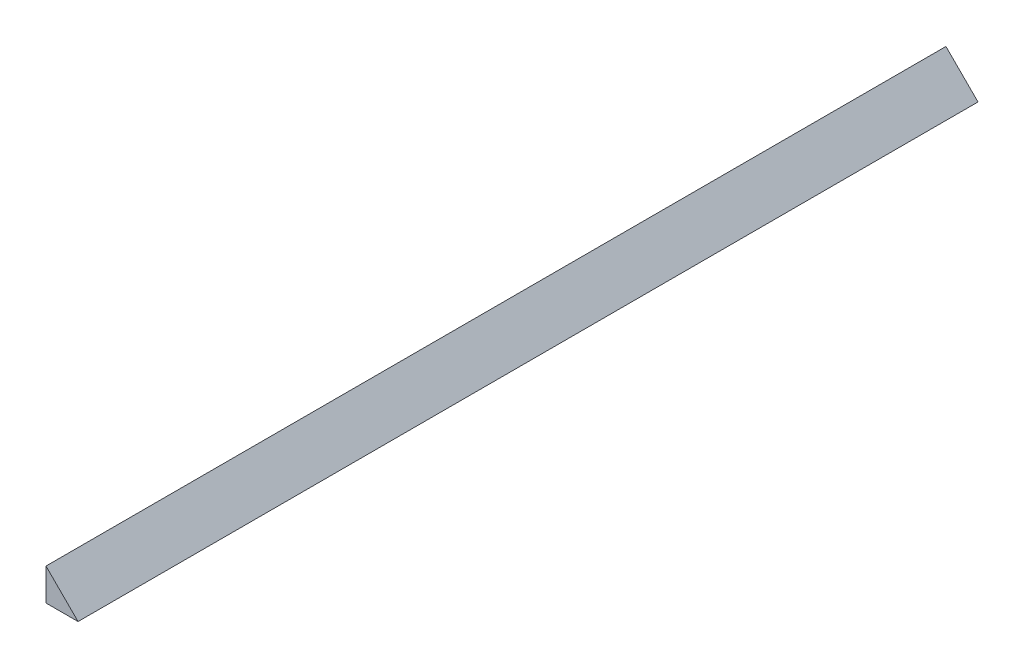
ISO-10303-21;
HEADER;
FILE_DESCRIPTION(('STEP AP214'),'2;1');
FILE_NAME('part.step','',(''),(''),'','','');
FILE_SCHEMA(('AUTOMOTIVE_DESIGN { 1 0 10303 214 1 1 1 1 }'));
ENDSEC;
DATA;
#1=APPLICATION_CONTEXT('core data for automotive mechanical design processes');
#2=APPLICATION_PROTOCOL_DEFINITION('international standard','automotive_design',2000,#1);
#3=PRODUCT_CONTEXT('',#1,'mechanical');
#4=PRODUCT('Part','Part','',(#3));
#5=PRODUCT_RELATED_PRODUCT_CATEGORY('part','',(#4));
#6=PRODUCT_DEFINITION_FORMATION('','',#4);
#7=PRODUCT_DEFINITION_CONTEXT('part definition',#1,'design');
#8=PRODUCT_DEFINITION('design','',#6,#7);
#9=PRODUCT_DEFINITION_SHAPE('','',#8);
#10=(LENGTH_UNIT() NAMED_UNIT(*) SI_UNIT(.MILLI.,.METRE.));
#11=(NAMED_UNIT(*) PLANE_ANGLE_UNIT() SI_UNIT($,.RADIAN.));
#12=(NAMED_UNIT(*) SI_UNIT($,.STERADIAN.) SOLID_ANGLE_UNIT());
#13=UNCERTAINTY_MEASURE_WITH_UNIT(LENGTH_MEASURE(1.E-05),#10,'distance_accuracy_value','');
#14=(GEOMETRIC_REPRESENTATION_CONTEXT(3) GLOBAL_UNCERTAINTY_ASSIGNED_CONTEXT((#13)) GLOBAL_UNIT_ASSIGNED_CONTEXT((#10,
#11,#12)) REPRESENTATION_CONTEXT('',''));
#15=CARTESIAN_POINT('',(0.,0.,0.));
#16=DIRECTION('',(0.,0.,1.));
#17=DIRECTION('',(1.,0.,0.));
#18=AXIS2_PLACEMENT_3D('',#15,#16,#17);
#19=CARTESIAN_POINT('',(0.,2.6,-76.6769552621701));
#20=DIRECTION('',(-1.,0.,0.));
#21=DIRECTION('',(0.,0.,1.));
#22=AXIS2_PLACEMENT_3D('',#19,#20,#21);
#23=PLANE('',#22);
#24=DIRECTION('',(0.,1.,0.));
#25=VECTOR('',#24,1.);
#26=CARTESIAN_POINT('',(0.,2.6,-73.));
#27=LINE('',#26,#25);
#28=CARTESIAN_POINT('',(0.,0.,-73.));
#29=VERTEX_POINT('',#28);
#30=CARTESIAN_POINT('',(0.,2.60000000000004,-73.));
#31=VERTEX_POINT('',#30);
#32=EDGE_CURVE('E11',#29,#31,#27,.T.);
#33=ORIENTED_EDGE('',*,*,#32,.F.);
#34=DIRECTION('',(0.,0.,1.));
#35=VECTOR('',#34,1.);
#36=CARTESIAN_POINT('',(0.,0.,-76.6769552621701));
#37=LINE('',#36,#35);
#38=CARTESIAN_POINT('',(0.,0.,0.));
#39=VERTEX_POINT('',#38);
#40=EDGE_CURVE('E105',#29,#39,#37,.T.);
#41=ORIENTED_EDGE('',*,*,#40,.T.);
#42=DIRECTION('',(0.,-1.,0.));
#43=VECTOR('',#42,1.);
#44=CARTESIAN_POINT('',(0.,2.6,0.));
#45=LINE('',#44,#43);
#46=CARTESIAN_POINT('',(0.,2.6,0.));
#47=VERTEX_POINT('',#46);
#48=EDGE_CURVE('E85',#47,#39,#45,.T.);
#49=ORIENTED_EDGE('',*,*,#48,.F.);
#50=DIRECTION('',(0.,0.,1.));
#51=VECTOR('',#50,1.);
#52=CARTESIAN_POINT('',(0.,2.6,-76.6769552621701));
#53=LINE('',#52,#51);
#54=EDGE_CURVE('E86',#31,#47,#53,.T.);
#55=ORIENTED_EDGE('',*,*,#54,.F.);
#56=EDGE_LOOP('',(#33,#41,#49,#55));
#57=FACE_BOUND('',#56,.T.);
#58=ADVANCED_FACE('F39',(#57),#23,.T.);
#59=CARTESIAN_POINT('',(2.59999999999997,0.,-76.6769552621701));
#60=DIRECTION('',(0.707106781186551,0.707106781186544,0.));
#61=DIRECTION('',(-0.707106781186544,0.707106781186551,0.));
#62=AXIS2_PLACEMENT_3D('',#59,#60,#61);
#63=PLANE('',#62);
#64=DIRECTION('',(0.707106781186544,-0.707106781186551,0.));
#65=VECTOR('',#64,1.);
#66=CARTESIAN_POINT('',(2.59999999999997,0.,-73.));
#67=LINE('',#66,#65);
#68=CARTESIAN_POINT('',(2.59999999999997,0.,-73.));
#69=VERTEX_POINT('',#68);
#70=EDGE_CURVE('E43',#31,#69,#67,.T.);
#71=ORIENTED_EDGE('',*,*,#70,.F.);
#72=ORIENTED_EDGE('',*,*,#54,.T.);
#73=DIRECTION('',(-0.707106781186544,0.707106781186551,0.));
#74=VECTOR('',#73,1.);
#75=CARTESIAN_POINT('',(2.59999999999997,0.,0.));
#76=LINE('',#75,#74);
#77=CARTESIAN_POINT('',(2.59999999999997,0.,0.));
#78=VERTEX_POINT('',#77);
#79=EDGE_CURVE('E91',#78,#47,#76,.T.);
#80=ORIENTED_EDGE('',*,*,#79,.F.);
#81=DIRECTION('',(0.,0.,1.));
#82=VECTOR('',#81,1.);
#83=CARTESIAN_POINT('',(2.59999999999997,0.,-76.6769552621701));
#84=LINE('',#83,#82);
#85=EDGE_CURVE('E76',#69,#78,#84,.T.);
#86=ORIENTED_EDGE('',*,*,#85,.F.);
#87=EDGE_LOOP('',(#71,#72,#80,#86));
#88=FACE_BOUND('',#87,.T.);
#89=ADVANCED_FACE('F95',(#88),#63,.T.);
#90=CARTESIAN_POINT('',(0.,0.,-76.6769552621701));
#91=DIRECTION('',(0.,-1.,0.));
#92=DIRECTION('',(0.,0.,-1.));
#93=AXIS2_PLACEMENT_3D('',#90,#91,#92);
#94=PLANE('',#93);
#95=DIRECTION('',(-1.,0.,0.));
#96=VECTOR('',#95,1.);
#97=CARTESIAN_POINT('',(0.,0.,-73.));
#98=LINE('',#97,#96);
#99=EDGE_CURVE('E50',#69,#29,#98,.T.);
#100=ORIENTED_EDGE('',*,*,#99,.F.);
#101=ORIENTED_EDGE('',*,*,#85,.T.);
#102=DIRECTION('',(1.,0.,0.));
#103=VECTOR('',#102,1.);
#104=CARTESIAN_POINT('',(0.,0.,0.));
#105=LINE('',#104,#103);
#106=EDGE_CURVE('E80',#39,#78,#105,.T.);
#107=ORIENTED_EDGE('',*,*,#106,.F.);
#108=ORIENTED_EDGE('',*,*,#40,.F.);
#109=EDGE_LOOP('',(#100,#101,#107,#108));
#110=FACE_BOUND('',#109,.T.);
#111=ADVANCED_FACE('F78',(#110),#94,.T.);
#112=CARTESIAN_POINT('',(0.,0.,0.));
#113=DIRECTION('',(0.,0.,1.));
#114=DIRECTION('',(1.,0.,0.));
#115=AXIS2_PLACEMENT_3D('',#112,#113,#114);
#116=PLANE('',#115);
#117=ORIENTED_EDGE('',*,*,#48,.T.);
#118=ORIENTED_EDGE('',*,*,#106,.T.);
#119=ORIENTED_EDGE('',*,*,#79,.T.);
#120=EDGE_LOOP('',(#117,#118,#119));
#121=FACE_BOUND('',#120,.T.);
#122=ADVANCED_FACE('F90',(#121),#116,.T.);
#123=CARTESIAN_POINT('',(7.49999999999997,202.4,-73.));
#124=DIRECTION('',(0.,0.,1.));
#125=DIRECTION('',(-1.,0.,0.));
#126=AXIS2_PLACEMENT_3D('',#123,#124,#125);
#127=PLANE('',#126);
#128=ORIENTED_EDGE('',*,*,#70,.T.);
#129=ORIENTED_EDGE('',*,*,#99,.T.);
#130=ORIENTED_EDGE('',*,*,#32,.T.);
#131=EDGE_LOOP('',(#128,#129,#130));
#132=FACE_BOUND('',#131,.T.);
#133=ADVANCED_FACE('F41',(#132),#127,.F.);
#134=CLOSED_SHELL('',(#58,#89,#111,#122,#133));
#135=MANIFOLD_SOLID_BREP('B2',#134);
#136=ADVANCED_BREP_SHAPE_REPRESENTATION('',(#18,#135),#14);
#137=SHAPE_DEFINITION_REPRESENTATION(#9,#136);
ENDSEC;
END-ISO-10303-21;
